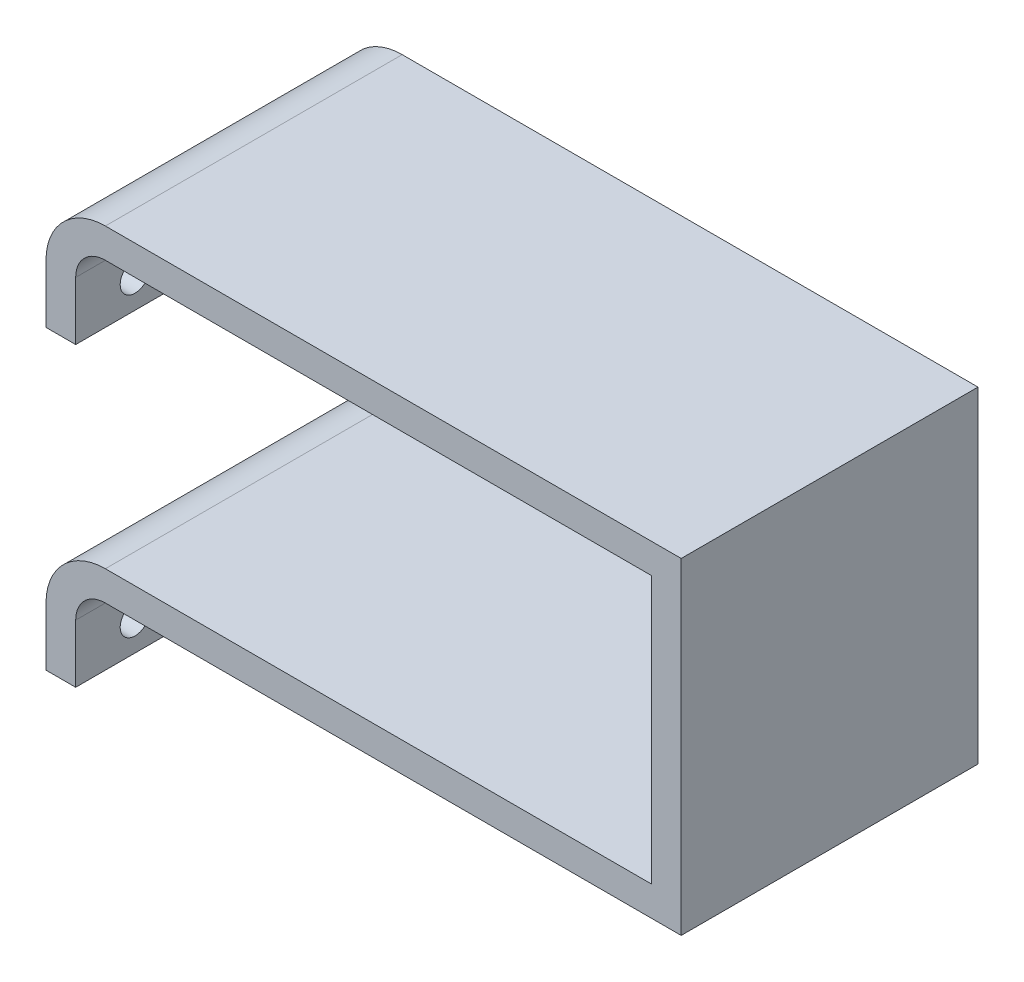
ISO-10303-21;
HEADER;
FILE_DESCRIPTION(('STEP AP214'),'2;1');
FILE_NAME('part.step','',(''),(''),'','','');
FILE_SCHEMA(('AUTOMOTIVE_DESIGN { 1 0 10303 214 1 1 1 1 }'));
ENDSEC;
DATA;
#1=APPLICATION_CONTEXT('core data for automotive mechanical design processes');
#2=APPLICATION_PROTOCOL_DEFINITION('international standard','automotive_design',2000,#1);
#3=PRODUCT_CONTEXT('',#1,'mechanical');
#4=PRODUCT('Part','Part','',(#3));
#5=PRODUCT_RELATED_PRODUCT_CATEGORY('part','',(#4));
#6=PRODUCT_DEFINITION_FORMATION('','',#4);
#7=PRODUCT_DEFINITION_CONTEXT('part definition',#1,'design');
#8=PRODUCT_DEFINITION('design','',#6,#7);
#9=PRODUCT_DEFINITION_SHAPE('','',#8);
#10=(LENGTH_UNIT() NAMED_UNIT(*) SI_UNIT(.MILLI.,.METRE.));
#11=(NAMED_UNIT(*) PLANE_ANGLE_UNIT() SI_UNIT($,.RADIAN.));
#12=(NAMED_UNIT(*) SI_UNIT($,.STERADIAN.) SOLID_ANGLE_UNIT());
#13=UNCERTAINTY_MEASURE_WITH_UNIT(LENGTH_MEASURE(1.E-05),#10,'distance_accuracy_value','');
#14=(GEOMETRIC_REPRESENTATION_CONTEXT(3) GLOBAL_UNCERTAINTY_ASSIGNED_CONTEXT((#13)) GLOBAL_UNIT_ASSIGNED_CONTEXT((#10,
#11,#12)) REPRESENTATION_CONTEXT('',''));
#15=CARTESIAN_POINT('',(0.,0.,0.));
#16=DIRECTION('',(0.,0.,1.));
#17=DIRECTION('',(1.,0.,0.));
#18=AXIS2_PLACEMENT_3D('',#15,#16,#17);
#19=CARTESIAN_POINT('',(20.,119.6,100.));
#20=DIRECTION('',(0.,0.,-1.));
#21=DIRECTION('',(-1.,0.,0.));
#22=AXIS2_PLACEMENT_3D('',#19,#20,#21);
#23=CYLINDRICAL_SURFACE('',#22,9.99999999999997);
#24=CARTESIAN_POINT('',(20.,119.6,0.));
#25=DIRECTION('',(0.,0.,1.));
#26=DIRECTION('',(1.,0.,0.));
#27=AXIS2_PLACEMENT_3D('',#24,#25,#26);
#28=CIRCLE('',#27,9.99999999999997);
#29=CARTESIAN_POINT('',(20.,129.6,0.));
#30=VERTEX_POINT('',#29);
#31=CARTESIAN_POINT('',(10.,119.6,0.));
#32=VERTEX_POINT('',#31);
#33=EDGE_CURVE('E197',#30,#32,#28,.T.);
#34=ORIENTED_EDGE('',*,*,#33,.F.);
#35=DIRECTION('',(0.,0.,-1.));
#36=VECTOR('',#35,1.);
#37=CARTESIAN_POINT('',(20.,129.6,100.));
#38=LINE('',#37,#36);
#39=CARTESIAN_POINT('',(20.,129.6,100.));
#40=VERTEX_POINT('',#39);
#41=EDGE_CURVE('E11',#40,#30,#38,.T.);
#42=ORIENTED_EDGE('',*,*,#41,.F.);
#43=CARTESIAN_POINT('',(20.,119.6,100.));
#44=DIRECTION('',(0.,0.,1.));
#45=DIRECTION('',(1.,0.,0.));
#46=AXIS2_PLACEMENT_3D('',#43,#44,#45);
#47=CIRCLE('',#46,9.99999999999997);
#48=CARTESIAN_POINT('',(10.,119.6,100.));
#49=VERTEX_POINT('',#48);
#50=EDGE_CURVE('E254',#40,#49,#47,.T.);
#51=ORIENTED_EDGE('',*,*,#50,.T.);
#52=DIRECTION('',(0.,0.,-1.));
#53=VECTOR('',#52,1.);
#54=CARTESIAN_POINT('',(10.,119.6,100.));
#55=LINE('',#54,#53);
#56=EDGE_CURVE('E66',#49,#32,#55,.T.);
#57=ORIENTED_EDGE('',*,*,#56,.T.);
#58=EDGE_LOOP('',(#34,#42,#51,#57));
#59=FACE_BOUND('',#58,.T.);
#60=ADVANCED_FACE('F47',(#59),#23,.F.);
#61=CARTESIAN_POINT('',(0.,129.6,100.));
#62=DIRECTION('',(0.,-1.,0.));
#63=DIRECTION('',(1.,0.,0.));
#64=AXIS2_PLACEMENT_3D('',#61,#62,#63);
#65=PLANE('',#64);
#66=DIRECTION('',(-1.,0.,0.));
#67=VECTOR('',#66,1.);
#68=CARTESIAN_POINT('',(0.,129.6,0.));
#69=LINE('',#68,#67);
#70=CARTESIAN_POINT('',(204.,129.6,0.));
#71=VERTEX_POINT('',#70);
#72=EDGE_CURVE('E200',#71,#30,#69,.T.);
#73=ORIENTED_EDGE('',*,*,#72,.F.);
#74=DIRECTION('',(0.,0.,-1.));
#75=VECTOR('',#74,1.);
#76=CARTESIAN_POINT('',(204.,129.6,100.));
#77=LINE('',#76,#75);
#78=CARTESIAN_POINT('',(204.,129.6,100.));
#79=VERTEX_POINT('',#78);
#80=EDGE_CURVE('E57',#79,#71,#77,.T.);
#81=ORIENTED_EDGE('',*,*,#80,.F.);
#82=DIRECTION('',(-1.,0.,0.));
#83=VECTOR('',#82,1.);
#84=CARTESIAN_POINT('',(0.,129.6,100.));
#85=LINE('',#84,#83);
#86=EDGE_CURVE('E319',#79,#40,#85,.T.);
#87=ORIENTED_EDGE('',*,*,#86,.T.);
#88=ORIENTED_EDGE('',*,*,#41,.T.);
#89=EDGE_LOOP('',(#73,#81,#87,#88));
#90=FACE_BOUND('',#89,.T.);
#91=ADVANCED_FACE('F383',(#90),#65,.T.);
#92=CARTESIAN_POINT('',(204.,0.,100.));
#93=DIRECTION('',(-1.,0.,0.));
#94=DIRECTION('',(0.,0.,1.));
#95=AXIS2_PLACEMENT_3D('',#92,#93,#94);
#96=PLANE('',#95);
#97=DIRECTION('',(0.,1.,0.));
#98=VECTOR('',#97,1.);
#99=CARTESIAN_POINT('',(204.,0.,0.));
#100=LINE('',#99,#98);
#101=CARTESIAN_POINT('',(204.,39.6,0.));
#102=VERTEX_POINT('',#101);
#103=EDGE_CURVE('E204',#102,#71,#100,.T.);
#104=ORIENTED_EDGE('',*,*,#103,.F.);
#105=DIRECTION('',(0.,0.,-1.));
#106=VECTOR('',#105,1.);
#107=CARTESIAN_POINT('',(204.,39.6,100.));
#108=LINE('',#107,#106);
#109=CARTESIAN_POINT('',(204.,39.6,100.));
#110=VERTEX_POINT('',#109);
#111=EDGE_CURVE('E291',#110,#102,#108,.T.);
#112=ORIENTED_EDGE('',*,*,#111,.F.);
#113=DIRECTION('',(0.,1.,0.));
#114=VECTOR('',#113,1.);
#115=CARTESIAN_POINT('',(204.,0.,100.));
#116=LINE('',#115,#114);
#117=EDGE_CURVE('E323',#110,#79,#116,.T.);
#118=ORIENTED_EDGE('',*,*,#117,.T.);
#119=ORIENTED_EDGE('',*,*,#80,.T.);
#120=EDGE_LOOP('',(#104,#112,#118,#119));
#121=FACE_BOUND('',#120,.T.);
#122=ADVANCED_FACE('F387',(#121),#96,.T.);
#123=CARTESIAN_POINT('',(0.,39.6,100.));
#124=DIRECTION('',(0.,1.,0.));
#125=DIRECTION('',(0.,0.,1.));
#126=AXIS2_PLACEMENT_3D('',#123,#124,#125);
#127=PLANE('',#126);
#128=DIRECTION('',(1.,0.,0.));
#129=VECTOR('',#128,1.);
#130=CARTESIAN_POINT('',(0.,39.6,0.));
#131=LINE('',#130,#129);
#132=CARTESIAN_POINT('',(20.,39.6,0.));
#133=VERTEX_POINT('',#132);
#134=EDGE_CURVE('E208',#133,#102,#131,.T.);
#135=ORIENTED_EDGE('',*,*,#134,.F.);
#136=DIRECTION('',(0.,0.,-1.));
#137=VECTOR('',#136,1.);
#138=CARTESIAN_POINT('',(20.,39.6,100.));
#139=LINE('',#138,#137);
#140=CARTESIAN_POINT('',(20.,39.6,100.));
#141=VERTEX_POINT('',#140);
#142=EDGE_CURVE('E288',#141,#133,#139,.T.);
#143=ORIENTED_EDGE('',*,*,#142,.F.);
#144=DIRECTION('',(1.,0.,0.));
#145=VECTOR('',#144,1.);
#146=CARTESIAN_POINT('',(0.,39.6,100.));
#147=LINE('',#146,#145);
#148=EDGE_CURVE('E327',#141,#110,#147,.T.);
#149=ORIENTED_EDGE('',*,*,#148,.T.);
#150=ORIENTED_EDGE('',*,*,#111,.T.);
#151=EDGE_LOOP('',(#135,#143,#149,#150));
#152=FACE_BOUND('',#151,.T.);
#153=ADVANCED_FACE('F397',(#152),#127,.T.);
#154=CARTESIAN_POINT('',(20.,19.6,100.));
#155=DIRECTION('',(0.,0.,-1.));
#156=DIRECTION('',(-1.,0.,0.));
#157=AXIS2_PLACEMENT_3D('',#154,#155,#156);
#158=CYLINDRICAL_SURFACE('',#157,20.);
#159=CARTESIAN_POINT('',(20.,19.6,0.));
#160=DIRECTION('',(0.,0.,1.));
#161=DIRECTION('',(1.,0.,0.));
#162=AXIS2_PLACEMENT_3D('',#159,#160,#161);
#163=CIRCLE('',#162,20.);
#164=CARTESIAN_POINT('',(0.,19.6,0.));
#165=VERTEX_POINT('',#164);
#166=EDGE_CURVE('E212',#133,#165,#163,.T.);
#167=ORIENTED_EDGE('',*,*,#166,.T.);
#168=DIRECTION('',(0.,0.,-1.));
#169=VECTOR('',#168,1.);
#170=CARTESIAN_POINT('',(0.,19.6,100.));
#171=LINE('',#170,#169);
#172=CARTESIAN_POINT('',(0.,19.6,100.));
#173=VERTEX_POINT('',#172);
#174=EDGE_CURVE('E285',#173,#165,#171,.T.);
#175=ORIENTED_EDGE('',*,*,#174,.F.);
#176=CARTESIAN_POINT('',(20.,19.6,100.));
#177=DIRECTION('',(0.,0.,1.));
#178=DIRECTION('',(1.,0.,0.));
#179=AXIS2_PLACEMENT_3D('',#176,#177,#178);
#180=CIRCLE('',#179,20.);
#181=EDGE_CURVE('E331',#141,#173,#180,.T.);
#182=ORIENTED_EDGE('',*,*,#181,.F.);
#183=ORIENTED_EDGE('',*,*,#142,.T.);
#184=EDGE_LOOP('',(#167,#175,#182,#183));
#185=FACE_BOUND('',#184,.T.);
#186=ADVANCED_FACE('F402',(#185),#158,.T.);
#187=CARTESIAN_POINT('',(0.,0.,100.));
#188=DIRECTION('',(-1.,0.,0.));
#189=DIRECTION('',(0.,0.,1.));
#190=AXIS2_PLACEMENT_3D('',#187,#188,#189);
#191=PLANE('',#190);
#192=CARTESIAN_POINT('',(0.,10.,20.));
#193=DIRECTION('',(-1.,0.,0.));
#194=DIRECTION('',(0.,0.,1.));
#195=AXIS2_PLACEMENT_3D('',#192,#193,#194);
#196=CIRCLE('',#195,5.);
#197=CARTESIAN_POINT('',(0.,10.,25.));
#198=VERTEX_POINT('',#197);
#199=EDGE_CURVE('E298',#198,#198,#196,.T.);
#200=ORIENTED_EDGE('',*,*,#199,.F.);
#201=EDGE_LOOP('',(#200));
#202=FACE_BOUND('',#201,.T.);
#203=CARTESIAN_POINT('',(0.,9.99999999999999,80.));
#204=DIRECTION('',(-1.,0.,0.));
#205=DIRECTION('',(0.,0.,-1.));
#206=AXIS2_PLACEMENT_3D('',#203,#204,#205);
#207=CIRCLE('',#206,5.);
#208=CARTESIAN_POINT('',(0.,9.99999999999999,75.));
#209=VERTEX_POINT('',#208);
#210=EDGE_CURVE('E305',#209,#209,#207,.T.);
#211=ORIENTED_EDGE('',*,*,#210,.F.);
#212=EDGE_LOOP('',(#211));
#213=FACE_BOUND('',#212,.T.);
#214=DIRECTION('',(0.,1.,0.));
#215=VECTOR('',#214,1.);
#216=CARTESIAN_POINT('',(0.,0.,0.));
#217=LINE('',#216,#215);
#218=CARTESIAN_POINT('',(0.,0.,0.));
#219=VERTEX_POINT('',#218);
#220=EDGE_CURVE('E216',#219,#165,#217,.T.);
#221=ORIENTED_EDGE('',*,*,#220,.F.);
#222=DIRECTION('',(0.,0.,-1.));
#223=VECTOR('',#222,1.);
#224=CARTESIAN_POINT('',(0.,0.,100.));
#225=LINE('',#224,#223);
#226=CARTESIAN_POINT('',(0.,0.,100.));
#227=VERTEX_POINT('',#226);
#228=EDGE_CURVE('E282',#227,#219,#225,.T.);
#229=ORIENTED_EDGE('',*,*,#228,.F.);
#230=DIRECTION('',(0.,1.,0.));
#231=VECTOR('',#230,1.);
#232=CARTESIAN_POINT('',(0.,0.,100.));
#233=LINE('',#232,#231);
#234=EDGE_CURVE('E334',#227,#173,#233,.T.);
#235=ORIENTED_EDGE('',*,*,#234,.T.);
#236=ORIENTED_EDGE('',*,*,#174,.T.);
#237=EDGE_LOOP('',(#221,#229,#235,#236));
#238=FACE_BOUND('',#237,.T.);
#239=ADVANCED_FACE('F406',(#202,#213,#238),#191,.T.);
#240=CARTESIAN_POINT('',(0.,0.,100.));
#241=DIRECTION('',(0.,1.,0.));
#242=DIRECTION('',(0.,0.,1.));
#243=AXIS2_PLACEMENT_3D('',#240,#241,#242);
#244=PLANE('',#243);
#245=DIRECTION('',(1.,0.,0.));
#246=VECTOR('',#245,1.);
#247=CARTESIAN_POINT('',(0.,0.,0.));
#248=LINE('',#247,#246);
#249=CARTESIAN_POINT('',(10.,0.,0.));
#250=VERTEX_POINT('',#249);
#251=EDGE_CURVE('E220',#219,#250,#248,.T.);
#252=ORIENTED_EDGE('',*,*,#251,.T.);
#253=DIRECTION('',(0.,0.,-1.));
#254=VECTOR('',#253,1.);
#255=CARTESIAN_POINT('',(10.,0.,100.));
#256=LINE('',#255,#254);
#257=CARTESIAN_POINT('',(10.,0.,100.));
#258=VERTEX_POINT('',#257);
#259=EDGE_CURVE('E279',#258,#250,#256,.T.);
#260=ORIENTED_EDGE('',*,*,#259,.F.);
#261=DIRECTION('',(1.,0.,0.));
#262=VECTOR('',#261,1.);
#263=CARTESIAN_POINT('',(0.,0.,100.));
#264=LINE('',#263,#262);
#265=EDGE_CURVE('E338',#227,#258,#264,.T.);
#266=ORIENTED_EDGE('',*,*,#265,.F.);
#267=ORIENTED_EDGE('',*,*,#228,.T.);
#268=EDGE_LOOP('',(#252,#260,#266,#267));
#269=FACE_BOUND('',#268,.T.);
#270=ADVANCED_FACE('F411',(#269),#244,.F.);
#271=CARTESIAN_POINT('',(10.,0.,100.));
#272=DIRECTION('',(1.,0.,0.));
#273=DIRECTION('',(0.,0.,-1.));
#274=AXIS2_PLACEMENT_3D('',#271,#272,#273);
#275=PLANE('',#274);
#276=CARTESIAN_POINT('',(10.,10.,20.));
#277=DIRECTION('',(1.,0.,0.));
#278=DIRECTION('',(0.,0.,-1.));
#279=AXIS2_PLACEMENT_3D('',#276,#277,#278);
#280=CIRCLE('',#279,5.);
#281=CARTESIAN_POINT('',(10.,10.,15.));
#282=VERTEX_POINT('',#281);
#283=EDGE_CURVE('E50',#282,#282,#280,.T.);
#284=ORIENTED_EDGE('',*,*,#283,.F.);
#285=EDGE_LOOP('',(#284));
#286=FACE_BOUND('',#285,.T.);
#287=CARTESIAN_POINT('',(10.,9.99999999999999,80.));
#288=DIRECTION('',(1.,0.,0.));
#289=DIRECTION('',(0.,0.,-1.));
#290=AXIS2_PLACEMENT_3D('',#287,#288,#289);
#291=CIRCLE('',#290,5.);
#292=CARTESIAN_POINT('',(10.,9.99999999999999,75.));
#293=VERTEX_POINT('',#292);
#294=EDGE_CURVE('E295',#293,#293,#291,.T.);
#295=ORIENTED_EDGE('',*,*,#294,.F.);
#296=EDGE_LOOP('',(#295));
#297=FACE_BOUND('',#296,.T.);
#298=DIRECTION('',(0.,-1.,0.));
#299=VECTOR('',#298,1.);
#300=CARTESIAN_POINT('',(10.,0.,0.));
#301=LINE('',#300,#299);
#302=CARTESIAN_POINT('',(10.,19.6,0.));
#303=VERTEX_POINT('',#302);
#304=EDGE_CURVE('E224',#303,#250,#301,.T.);
#305=ORIENTED_EDGE('',*,*,#304,.F.);
#306=DIRECTION('',(0.,0.,-1.));
#307=VECTOR('',#306,1.);
#308=CARTESIAN_POINT('',(10.,19.6,100.));
#309=LINE('',#308,#307);
#310=CARTESIAN_POINT('',(10.,19.6,100.));
#311=VERTEX_POINT('',#310);
#312=EDGE_CURVE('E276',#311,#303,#309,.T.);
#313=ORIENTED_EDGE('',*,*,#312,.F.);
#314=DIRECTION('',(0.,-1.,0.));
#315=VECTOR('',#314,1.);
#316=CARTESIAN_POINT('',(10.,0.,100.));
#317=LINE('',#316,#315);
#318=EDGE_CURVE('E341',#311,#258,#317,.T.);
#319=ORIENTED_EDGE('',*,*,#318,.T.);
#320=ORIENTED_EDGE('',*,*,#259,.T.);
#321=EDGE_LOOP('',(#305,#313,#319,#320));
#322=FACE_BOUND('',#321,.T.);
#323=ADVANCED_FACE('F427',(#286,#297,#322),#275,.T.);
#324=CARTESIAN_POINT('',(20.,19.6,100.));
#325=DIRECTION('',(0.,0.,-1.));
#326=DIRECTION('',(-1.,0.,0.));
#327=AXIS2_PLACEMENT_3D('',#324,#325,#326);
#328=CYLINDRICAL_SURFACE('',#327,10.);
#329=CARTESIAN_POINT('',(20.,19.6,0.));
#330=DIRECTION('',(0.,0.,1.));
#331=DIRECTION('',(1.,0.,0.));
#332=AXIS2_PLACEMENT_3D('',#329,#330,#331);
#333=CIRCLE('',#332,10.);
#334=CARTESIAN_POINT('',(20.,29.6,0.));
#335=VERTEX_POINT('',#334);
#336=EDGE_CURVE('E228',#335,#303,#333,.T.);
#337=ORIENTED_EDGE('',*,*,#336,.F.);
#338=DIRECTION('',(0.,0.,-1.));
#339=VECTOR('',#338,1.);
#340=CARTESIAN_POINT('',(20.,29.6,100.));
#341=LINE('',#340,#339);
#342=CARTESIAN_POINT('',(20.,29.6,100.));
#343=VERTEX_POINT('',#342);
#344=EDGE_CURVE('E273',#343,#335,#341,.T.);
#345=ORIENTED_EDGE('',*,*,#344,.F.);
#346=CARTESIAN_POINT('',(20.,19.6,100.));
#347=DIRECTION('',(0.,0.,1.));
#348=DIRECTION('',(1.,0.,0.));
#349=AXIS2_PLACEMENT_3D('',#346,#347,#348);
#350=CIRCLE('',#349,10.);
#351=EDGE_CURVE('E345',#343,#311,#350,.T.);
#352=ORIENTED_EDGE('',*,*,#351,.T.);
#353=ORIENTED_EDGE('',*,*,#312,.T.);
#354=EDGE_LOOP('',(#337,#345,#352,#353));
#355=FACE_BOUND('',#354,.T.);
#356=ADVANCED_FACE('F417',(#355),#328,.F.);
#357=CARTESIAN_POINT('',(0.,29.6,100.));
#358=DIRECTION('',(0.,1.,0.));
#359=DIRECTION('',(0.,0.,1.));
#360=AXIS2_PLACEMENT_3D('',#357,#358,#359);
#361=PLANE('',#360);
#362=DIRECTION('',(1.,0.,0.));
#363=VECTOR('',#362,1.);
#364=CARTESIAN_POINT('',(0.,29.6,0.));
#365=LINE('',#364,#363);
#366=CARTESIAN_POINT('',(214.,29.6,0.));
#367=VERTEX_POINT('',#366);
#368=EDGE_CURVE('E232',#335,#367,#365,.T.);
#369=ORIENTED_EDGE('',*,*,#368,.T.);
#370=DIRECTION('',(0.,0.,-1.));
#371=VECTOR('',#370,1.);
#372=CARTESIAN_POINT('',(214.,29.6,100.));
#373=LINE('',#372,#371);
#374=CARTESIAN_POINT('',(214.,29.6,100.));
#375=VERTEX_POINT('',#374);
#376=EDGE_CURVE('E269',#375,#367,#373,.T.);
#377=ORIENTED_EDGE('',*,*,#376,.F.);
#378=DIRECTION('',(1.,0.,0.));
#379=VECTOR('',#378,1.);
#380=CARTESIAN_POINT('',(0.,29.6,100.));
#381=LINE('',#380,#379);
#382=EDGE_CURVE('E349',#343,#375,#381,.T.);
#383=ORIENTED_EDGE('',*,*,#382,.F.);
#384=ORIENTED_EDGE('',*,*,#344,.T.);
#385=EDGE_LOOP('',(#369,#377,#383,#384));
#386=FACE_BOUND('',#385,.T.);
#387=ADVANCED_FACE('F423',(#386),#361,.F.);
#388=CARTESIAN_POINT('',(214.,0.,100.));
#389=DIRECTION('',(-1.,0.,0.));
#390=DIRECTION('',(0.,0.,1.));
#391=AXIS2_PLACEMENT_3D('',#388,#389,#390);
#392=PLANE('',#391);
#393=DIRECTION('',(0.,1.,0.));
#394=VECTOR('',#393,1.);
#395=CARTESIAN_POINT('',(214.,0.,0.));
#396=LINE('',#395,#394);
#397=CARTESIAN_POINT('',(214.,139.6,0.));
#398=VERTEX_POINT('',#397);
#399=EDGE_CURVE('E235',#367,#398,#396,.T.);
#400=ORIENTED_EDGE('',*,*,#399,.T.);
#401=DIRECTION('',(0.,0.,-1.));
#402=VECTOR('',#401,1.);
#403=CARTESIAN_POINT('',(214.,139.6,100.));
#404=LINE('',#403,#402);
#405=CARTESIAN_POINT('',(214.,139.6,100.));
#406=VERTEX_POINT('',#405);
#407=EDGE_CURVE('E265',#406,#398,#404,.T.);
#408=ORIENTED_EDGE('',*,*,#407,.F.);
#409=DIRECTION('',(0.,1.,0.));
#410=VECTOR('',#409,1.);
#411=CARTESIAN_POINT('',(214.,0.,100.));
#412=LINE('',#411,#410);
#413=EDGE_CURVE('E352',#375,#406,#412,.T.);
#414=ORIENTED_EDGE('',*,*,#413,.F.);
#415=ORIENTED_EDGE('',*,*,#376,.T.);
#416=EDGE_LOOP('',(#400,#408,#414,#415));
#417=FACE_BOUND('',#416,.T.);
#418=ADVANCED_FACE('F426',(#417),#392,.F.);
#419=CARTESIAN_POINT('',(0.,139.6,100.));
#420=DIRECTION('',(0.,-1.,0.));
#421=DIRECTION('',(1.,0.,0.));
#422=AXIS2_PLACEMENT_3D('',#419,#420,#421);
#423=PLANE('',#422);
#424=DIRECTION('',(-1.,0.,0.));
#425=VECTOR('',#424,1.);
#426=CARTESIAN_POINT('',(0.,139.6,0.));
#427=LINE('',#426,#425);
#428=CARTESIAN_POINT('',(20.,139.6,0.));
#429=VERTEX_POINT('',#428);
#430=EDGE_CURVE('E238',#398,#429,#427,.T.);
#431=ORIENTED_EDGE('',*,*,#430,.T.);
#432=DIRECTION('',(0.,0.,-1.));
#433=VECTOR('',#432,1.);
#434=CARTESIAN_POINT('',(20.,139.6,100.));
#435=LINE('',#434,#433);
#436=CARTESIAN_POINT('',(20.,139.6,100.));
#437=VERTEX_POINT('',#436);
#438=EDGE_CURVE('E261',#437,#429,#435,.T.);
#439=ORIENTED_EDGE('',*,*,#438,.F.);
#440=DIRECTION('',(-1.,0.,0.));
#441=VECTOR('',#440,1.);
#442=CARTESIAN_POINT('',(0.,139.6,100.));
#443=LINE('',#442,#441);
#444=EDGE_CURVE('E191',#406,#437,#443,.T.);
#445=ORIENTED_EDGE('',*,*,#444,.F.);
#446=ORIENTED_EDGE('',*,*,#407,.T.);
#447=EDGE_LOOP('',(#431,#439,#445,#446));
#448=FACE_BOUND('',#447,.T.);
#449=ADVANCED_FACE('F360',(#448),#423,.F.);
#450=CARTESIAN_POINT('',(20.,119.6,100.));
#451=DIRECTION('',(0.,0.,-1.));
#452=DIRECTION('',(-1.,0.,0.));
#453=AXIS2_PLACEMENT_3D('',#450,#451,#452);
#454=CYLINDRICAL_SURFACE('',#453,20.);
#455=CARTESIAN_POINT('',(20.,119.6,0.));
#456=DIRECTION('',(0.,0.,1.));
#457=DIRECTION('',(1.,0.,0.));
#458=AXIS2_PLACEMENT_3D('',#455,#456,#457);
#459=CIRCLE('',#458,20.);
#460=CARTESIAN_POINT('',(0.,119.6,0.));
#461=VERTEX_POINT('',#460);
#462=EDGE_CURVE('E241',#429,#461,#459,.T.);
#463=ORIENTED_EDGE('',*,*,#462,.T.);
#464=DIRECTION('',(0.,0.,-1.));
#465=VECTOR('',#464,1.);
#466=CARTESIAN_POINT('',(0.,119.6,100.));
#467=LINE('',#466,#465);
#468=CARTESIAN_POINT('',(0.,119.6,100.));
#469=VERTEX_POINT('',#468);
#470=EDGE_CURVE('E175',#469,#461,#467,.T.);
#471=ORIENTED_EDGE('',*,*,#470,.F.);
#472=CARTESIAN_POINT('',(20.,119.6,100.));
#473=DIRECTION('',(0.,0.,1.));
#474=DIRECTION('',(1.,0.,0.));
#475=AXIS2_PLACEMENT_3D('',#472,#473,#474);
#476=CIRCLE('',#475,20.);
#477=EDGE_CURVE('E186',#437,#469,#476,.T.);
#478=ORIENTED_EDGE('',*,*,#477,.F.);
#479=ORIENTED_EDGE('',*,*,#438,.T.);
#480=EDGE_LOOP('',(#463,#471,#478,#479));
#481=FACE_BOUND('',#480,.T.);
#482=ADVANCED_FACE('F364',(#481),#454,.T.);
#483=CARTESIAN_POINT('',(0.,0.,100.));
#484=DIRECTION('',(-1.,0.,0.));
#485=DIRECTION('',(0.,0.,1.));
#486=AXIS2_PLACEMENT_3D('',#483,#484,#485);
#487=PLANE('',#486);
#488=CARTESIAN_POINT('',(0.,110.,80.));
#489=DIRECTION('',(-1.,0.,0.));
#490=DIRECTION('',(0.,0.,1.));
#491=AXIS2_PLACEMENT_3D('',#488,#489,#490);
#492=CIRCLE('',#491,5.00000000000001);
#493=CARTESIAN_POINT('',(0.,110.,85.));
#494=VERTEX_POINT('',#493);
#495=EDGE_CURVE('E595',#494,#494,#492,.T.);
#496=ORIENTED_EDGE('',*,*,#495,.F.);
#497=EDGE_LOOP('',(#496));
#498=FACE_BOUND('',#497,.T.);
#499=CARTESIAN_POINT('',(0.,110.,20.));
#500=DIRECTION('',(-1.,0.,0.));
#501=DIRECTION('',(0.,0.,1.));
#502=AXIS2_PLACEMENT_3D('',#499,#500,#501);
#503=CIRCLE('',#502,5.);
#504=CARTESIAN_POINT('',(0.,110.,25.));
#505=VERTEX_POINT('',#504);
#506=EDGE_CURVE('E597',#505,#505,#503,.T.);
#507=ORIENTED_EDGE('',*,*,#506,.F.);
#508=EDGE_LOOP('',(#507));
#509=FACE_BOUND('',#508,.T.);
#510=DIRECTION('',(0.,1.,0.));
#511=VECTOR('',#510,1.);
#512=CARTESIAN_POINT('',(0.,0.,0.));
#513=LINE('',#512,#511);
#514=CARTESIAN_POINT('',(0.,99.9999999999999,0.));
#515=VERTEX_POINT('',#514);
#516=EDGE_CURVE('E171',#515,#461,#513,.T.);
#517=ORIENTED_EDGE('',*,*,#516,.F.);
#518=DIRECTION('',(0.,0.,-1.));
#519=VECTOR('',#518,1.);
#520=CARTESIAN_POINT('',(0.,99.9999999999999,100.));
#521=LINE('',#520,#519);
#522=CARTESIAN_POINT('',(0.,99.9999999999999,100.));
#523=VERTEX_POINT('',#522);
#524=EDGE_CURVE('E165',#523,#515,#521,.T.);
#525=ORIENTED_EDGE('',*,*,#524,.F.);
#526=DIRECTION('',(0.,1.,0.));
#527=VECTOR('',#526,1.);
#528=CARTESIAN_POINT('',(0.,0.,100.));
#529=LINE('',#528,#527);
#530=EDGE_CURVE('E169',#523,#469,#529,.T.);
#531=ORIENTED_EDGE('',*,*,#530,.T.);
#532=ORIENTED_EDGE('',*,*,#470,.T.);
#533=EDGE_LOOP('',(#517,#525,#531,#532));
#534=FACE_BOUND('',#533,.T.);
#535=ADVANCED_FACE('F167',(#498,#509,#534),#487,.T.);
#536=CARTESIAN_POINT('',(0.,99.9999999999999,100.));
#537=DIRECTION('',(0.,1.,0.));
#538=DIRECTION('',(0.,0.,1.));
#539=AXIS2_PLACEMENT_3D('',#536,#537,#538);
#540=PLANE('',#539);
#541=DIRECTION('',(1.,0.,0.));
#542=VECTOR('',#541,1.);
#543=CARTESIAN_POINT('',(0.,99.9999999999999,0.));
#544=LINE('',#543,#542);
#545=CARTESIAN_POINT('',(10.,99.9999999999999,0.));
#546=VERTEX_POINT('',#545);
#547=EDGE_CURVE('E247',#515,#546,#544,.T.);
#548=ORIENTED_EDGE('',*,*,#547,.T.);
#549=DIRECTION('',(0.,0.,-1.));
#550=VECTOR('',#549,1.);
#551=CARTESIAN_POINT('',(10.,99.9999999999999,100.));
#552=LINE('',#551,#550);
#553=CARTESIAN_POINT('',(10.,99.9999999999999,100.));
#554=VERTEX_POINT('',#553);
#555=EDGE_CURVE('E116',#554,#546,#552,.T.);
#556=ORIENTED_EDGE('',*,*,#555,.F.);
#557=DIRECTION('',(1.,0.,0.));
#558=VECTOR('',#557,1.);
#559=CARTESIAN_POINT('',(0.,99.9999999999999,100.));
#560=LINE('',#559,#558);
#561=EDGE_CURVE('E177',#523,#554,#560,.T.);
#562=ORIENTED_EDGE('',*,*,#561,.F.);
#563=ORIENTED_EDGE('',*,*,#524,.T.);
#564=EDGE_LOOP('',(#548,#556,#562,#563));
#565=FACE_BOUND('',#564,.T.);
#566=ADVANCED_FACE('F178',(#565),#540,.F.);
#567=CARTESIAN_POINT('',(10.,0.,100.));
#568=DIRECTION('',(1.,0.,0.));
#569=DIRECTION('',(0.,1.,0.));
#570=AXIS2_PLACEMENT_3D('',#567,#568,#569);
#571=PLANE('',#570);
#572=CARTESIAN_POINT('',(10.,110.,80.));
#573=DIRECTION('',(-1.,0.,0.));
#574=DIRECTION('',(0.,0.,1.));
#575=AXIS2_PLACEMENT_3D('',#572,#573,#574);
#576=CIRCLE('',#575,5.00000000000001);
#577=CARTESIAN_POINT('',(10.,110.,85.));
#578=VERTEX_POINT('',#577);
#579=EDGE_CURVE('E311',#578,#578,#576,.T.);
#580=ORIENTED_EDGE('',*,*,#579,.T.);
#581=EDGE_LOOP('',(#580));
#582=FACE_BOUND('',#581,.T.);
#583=CARTESIAN_POINT('',(10.,110.,20.));
#584=DIRECTION('',(-1.,0.,0.));
#585=DIRECTION('',(0.,0.,1.));
#586=AXIS2_PLACEMENT_3D('',#583,#584,#585);
#587=CIRCLE('',#586,5.);
#588=CARTESIAN_POINT('',(10.,110.,25.));
#589=VERTEX_POINT('',#588);
#590=EDGE_CURVE('E314',#589,#589,#587,.T.);
#591=ORIENTED_EDGE('',*,*,#590,.T.);
#592=EDGE_LOOP('',(#591));
#593=FACE_BOUND('',#592,.T.);
#594=DIRECTION('',(0.,-1.,0.));
#595=VECTOR('',#594,1.);
#596=CARTESIAN_POINT('',(10.,0.,0.));
#597=LINE('',#596,#595);
#598=EDGE_CURVE('E250',#32,#546,#597,.T.);
#599=ORIENTED_EDGE('',*,*,#598,.F.);
#600=ORIENTED_EDGE('',*,*,#56,.F.);
#601=DIRECTION('',(0.,-1.,0.));
#602=VECTOR('',#601,1.);
#603=CARTESIAN_POINT('',(10.,0.,100.));
#604=LINE('',#603,#602);
#605=EDGE_CURVE('E182',#49,#554,#604,.T.);
#606=ORIENTED_EDGE('',*,*,#605,.T.);
#607=ORIENTED_EDGE('',*,*,#555,.T.);
#608=EDGE_LOOP('',(#599,#600,#606,#607));
#609=FACE_BOUND('',#608,.T.);
#610=ADVANCED_FACE('F367',(#582,#593,#609),#571,.T.);
#611=CARTESIAN_POINT('',(0.,0.,100.));
#612=DIRECTION('',(0.,0.,1.));
#613=DIRECTION('',(1.,0.,0.));
#614=AXIS2_PLACEMENT_3D('',#611,#612,#613);
#615=PLANE('',#614);
#616=ORIENTED_EDGE('',*,*,#50,.F.);
#617=ORIENTED_EDGE('',*,*,#86,.F.);
#618=ORIENTED_EDGE('',*,*,#117,.F.);
#619=ORIENTED_EDGE('',*,*,#148,.F.);
#620=ORIENTED_EDGE('',*,*,#181,.T.);
#621=ORIENTED_EDGE('',*,*,#234,.F.);
#622=ORIENTED_EDGE('',*,*,#265,.T.);
#623=ORIENTED_EDGE('',*,*,#318,.F.);
#624=ORIENTED_EDGE('',*,*,#351,.F.);
#625=ORIENTED_EDGE('',*,*,#382,.T.);
#626=ORIENTED_EDGE('',*,*,#413,.T.);
#627=ORIENTED_EDGE('',*,*,#444,.T.);
#628=ORIENTED_EDGE('',*,*,#477,.T.);
#629=ORIENTED_EDGE('',*,*,#530,.F.);
#630=ORIENTED_EDGE('',*,*,#561,.T.);
#631=ORIENTED_EDGE('',*,*,#605,.F.);
#632=EDGE_LOOP('',(#616,#617,#618,#619,#620,#621,#622,#623,#624,#625,#626,#627,#628,#629,#630,#631));
#633=FACE_BOUND('',#632,.T.);
#634=ADVANCED_FACE('F184',(#633),#615,.T.);
#635=CARTESIAN_POINT('',(0.,0.,0.));
#636=DIRECTION('',(0.,0.,1.));
#637=DIRECTION('',(1.,0.,0.));
#638=AXIS2_PLACEMENT_3D('',#635,#636,#637);
#639=PLANE('',#638);
#640=ORIENTED_EDGE('',*,*,#33,.T.);
#641=ORIENTED_EDGE('',*,*,#598,.T.);
#642=ORIENTED_EDGE('',*,*,#547,.F.);
#643=ORIENTED_EDGE('',*,*,#516,.T.);
#644=ORIENTED_EDGE('',*,*,#462,.F.);
#645=ORIENTED_EDGE('',*,*,#430,.F.);
#646=ORIENTED_EDGE('',*,*,#399,.F.);
#647=ORIENTED_EDGE('',*,*,#368,.F.);
#648=ORIENTED_EDGE('',*,*,#336,.T.);
#649=ORIENTED_EDGE('',*,*,#304,.T.);
#650=ORIENTED_EDGE('',*,*,#251,.F.);
#651=ORIENTED_EDGE('',*,*,#220,.T.);
#652=ORIENTED_EDGE('',*,*,#166,.F.);
#653=ORIENTED_EDGE('',*,*,#134,.T.);
#654=ORIENTED_EDGE('',*,*,#103,.T.);
#655=ORIENTED_EDGE('',*,*,#72,.T.);
#656=EDGE_LOOP('',(#640,#641,#642,#643,#644,#645,#646,#647,#648,#649,#650,#651,#652,#653,#654,#655));
#657=FACE_BOUND('',#656,.T.);
#658=ADVANCED_FACE('F366',(#657),#639,.F.);
#659=CARTESIAN_POINT('',(214.,9.99999999999999,80.));
#660=DIRECTION('',(-1.,0.,0.));
#661=DIRECTION('',(0.,0.,1.));
#662=AXIS2_PLACEMENT_3D('',#659,#660,#661);
#663=CYLINDRICAL_SURFACE('',#662,5.);
#664=ORIENTED_EDGE('',*,*,#294,.T.);
#665=EDGE_LOOP('',(#664));
#666=FACE_BOUND('',#665,.T.);
#667=ORIENTED_EDGE('',*,*,#210,.T.);
#668=EDGE_LOOP('',(#667));
#669=FACE_BOUND('',#668,.T.);
#670=ADVANCED_FACE('F519',(#666,#669),#663,.F.);
#671=CARTESIAN_POINT('',(214.,10.,20.));
#672=DIRECTION('',(-1.,0.,0.));
#673=DIRECTION('',(0.,0.,1.));
#674=AXIS2_PLACEMENT_3D('',#671,#672,#673);
#675=CYLINDRICAL_SURFACE('',#674,5.);
#676=ORIENTED_EDGE('',*,*,#283,.T.);
#677=EDGE_LOOP('',(#676));
#678=FACE_BOUND('',#677,.T.);
#679=ORIENTED_EDGE('',*,*,#199,.T.);
#680=EDGE_LOOP('',(#679));
#681=FACE_BOUND('',#680,.T.);
#682=ADVANCED_FACE('F561',(#678,#681),#675,.F.);
#683=CARTESIAN_POINT('',(10.,110.,20.));
#684=DIRECTION('',(-1.,0.,0.));
#685=DIRECTION('',(0.,0.,1.));
#686=AXIS2_PLACEMENT_3D('',#683,#684,#685);
#687=CYLINDRICAL_SURFACE('',#686,5.);
#688=ORIENTED_EDGE('',*,*,#590,.F.);
#689=EDGE_LOOP('',(#688));
#690=FACE_BOUND('',#689,.T.);
#691=ORIENTED_EDGE('',*,*,#506,.T.);
#692=EDGE_LOOP('',(#691));
#693=FACE_BOUND('',#692,.T.);
#694=ADVANCED_FACE('F569',(#690,#693),#687,.F.);
#695=CARTESIAN_POINT('',(10.,110.,80.));
#696=DIRECTION('',(-1.,0.,0.));
#697=DIRECTION('',(0.,0.,1.));
#698=AXIS2_PLACEMENT_3D('',#695,#696,#697);
#699=CYLINDRICAL_SURFACE('',#698,5.00000000000001);
#700=ORIENTED_EDGE('',*,*,#579,.F.);
#701=EDGE_LOOP('',(#700));
#702=FACE_BOUND('',#701,.T.);
#703=ORIENTED_EDGE('',*,*,#495,.T.);
#704=EDGE_LOOP('',(#703));
#705=FACE_BOUND('',#704,.T.);
#706=ADVANCED_FACE('F577',(#702,#705),#699,.F.);
#707=CLOSED_SHELL('',(#60,#91,#122,#153,#186,#239,#270,#323,#356,#387,#418,#449,#482,#535,#566,
#610,#634,#658,#670,#682,#694,#706));
#708=MANIFOLD_SOLID_BREP('B2',#707);
#709=ADVANCED_BREP_SHAPE_REPRESENTATION('',(#18,#708),#14);
#710=SHAPE_DEFINITION_REPRESENTATION(#9,#709);
ENDSEC;
END-ISO-10303-21;
